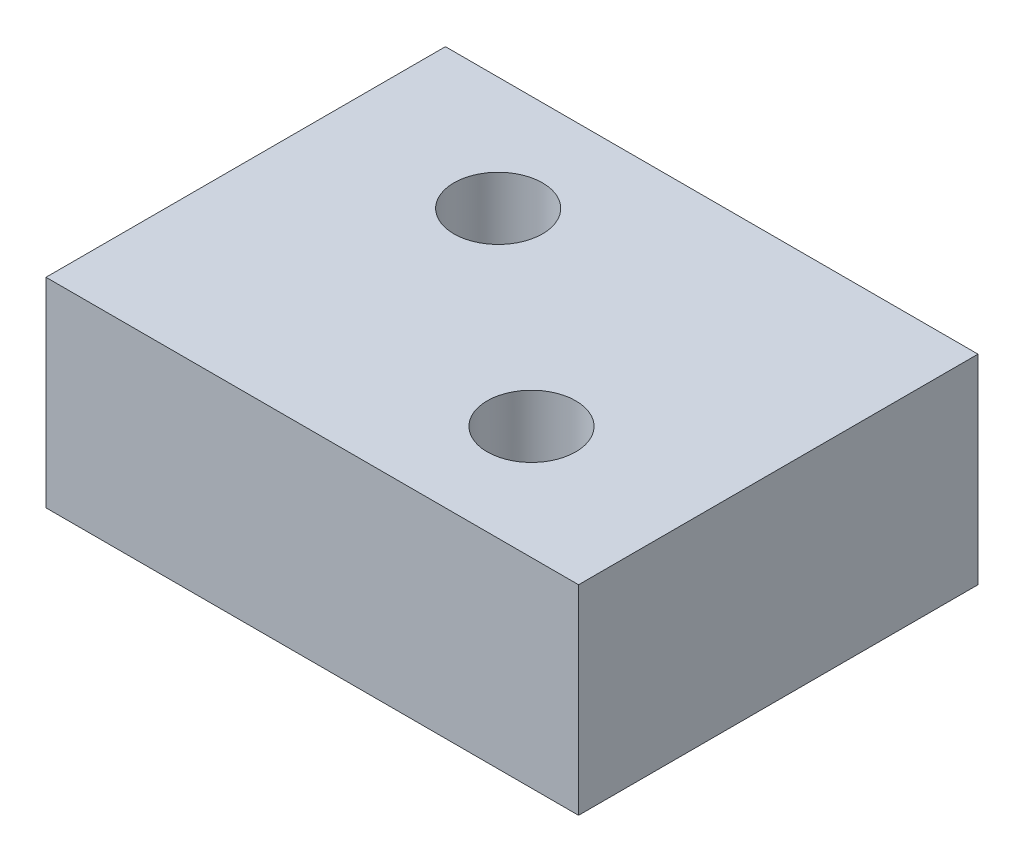
ISO-10303-21;
HEADER;
FILE_DESCRIPTION(('STEP AP214'),'2;1');
FILE_NAME('part.step','',(''),(''),'','','');
FILE_SCHEMA(('AUTOMOTIVE_DESIGN { 1 0 10303 214 1 1 1 1 }'));
ENDSEC;
DATA;
#1=APPLICATION_CONTEXT('core data for automotive mechanical design processes');
#2=APPLICATION_PROTOCOL_DEFINITION('international standard','automotive_design',2000,#1);
#3=PRODUCT_CONTEXT('',#1,'mechanical');
#4=PRODUCT('Part','Part','',(#3));
#5=PRODUCT_RELATED_PRODUCT_CATEGORY('part','',(#4));
#6=PRODUCT_DEFINITION_FORMATION('','',#4);
#7=PRODUCT_DEFINITION_CONTEXT('part definition',#1,'design');
#8=PRODUCT_DEFINITION('design','',#6,#7);
#9=PRODUCT_DEFINITION_SHAPE('','',#8);
#10=(LENGTH_UNIT() NAMED_UNIT(*) SI_UNIT(.MILLI.,.METRE.));
#11=(NAMED_UNIT(*) PLANE_ANGLE_UNIT() SI_UNIT($,.RADIAN.));
#12=(NAMED_UNIT(*) SI_UNIT($,.STERADIAN.) SOLID_ANGLE_UNIT());
#13=UNCERTAINTY_MEASURE_WITH_UNIT(LENGTH_MEASURE(1.E-05),#10,'distance_accuracy_value','');
#14=(GEOMETRIC_REPRESENTATION_CONTEXT(3) GLOBAL_UNCERTAINTY_ASSIGNED_CONTEXT((#13)) GLOBAL_UNIT_ASSIGNED_CONTEXT((#10,
#11,#12)) REPRESENTATION_CONTEXT('',''));
#15=CARTESIAN_POINT('',(0.,0.,0.));
#16=DIRECTION('',(0.,0.,1.));
#17=DIRECTION('',(1.,0.,0.));
#18=AXIS2_PLACEMENT_3D('',#15,#16,#17);
#19=CARTESIAN_POINT('',(20.,10.,15.));
#20=DIRECTION('',(-1.,0.,0.));
#21=DIRECTION('',(0.,0.,1.));
#22=AXIS2_PLACEMENT_3D('',#19,#20,#21);
#23=PLANE('',#22);
#24=DIRECTION('',(0.,0.,-1.));
#25=VECTOR('',#24,1.);
#26=CARTESIAN_POINT('',(20.,0.,15.));
#27=LINE('',#26,#25);
#28=CARTESIAN_POINT('',(20.,0.,15.));
#29=VERTEX_POINT('',#28);
#30=CARTESIAN_POINT('',(20.,0.,-15.));
#31=VERTEX_POINT('',#30);
#32=EDGE_CURVE('E166',#29,#31,#27,.T.);
#33=ORIENTED_EDGE('',*,*,#32,.T.);
#34=DIRECTION('',(0.,-1.,0.));
#35=VECTOR('',#34,1.);
#36=CARTESIAN_POINT('',(20.,10.,-15.));
#37=LINE('',#36,#35);
#38=CARTESIAN_POINT('',(20.,15.,-15.));
#39=VERTEX_POINT('',#38);
#40=EDGE_CURVE('E11',#39,#31,#37,.T.);
#41=ORIENTED_EDGE('',*,*,#40,.F.);
#42=DIRECTION('',(0.,0.,-1.));
#43=VECTOR('',#42,1.);
#44=CARTESIAN_POINT('',(20.,15.,15.));
#45=LINE('',#44,#43);
#46=CARTESIAN_POINT('',(20.,15.,15.));
#47=VERTEX_POINT('',#46);
#48=EDGE_CURVE('E103',#47,#39,#45,.T.);
#49=ORIENTED_EDGE('',*,*,#48,.F.);
#50=DIRECTION('',(0.,-1.,0.));
#51=VECTOR('',#50,1.);
#52=CARTESIAN_POINT('',(20.,10.,15.));
#53=LINE('',#52,#51);
#54=EDGE_CURVE('E94',#47,#29,#53,.T.);
#55=ORIENTED_EDGE('',*,*,#54,.T.);
#56=EDGE_LOOP('',(#33,#41,#49,#55));
#57=FACE_BOUND('',#56,.T.);
#58=ADVANCED_FACE('F46',(#57),#23,.F.);
#59=CARTESIAN_POINT('',(-20.,10.,-15.));
#60=DIRECTION('',(0.,0.,1.));
#61=DIRECTION('',(1.,0.,0.));
#62=AXIS2_PLACEMENT_3D('',#59,#60,#61);
#63=PLANE('',#62);
#64=DIRECTION('',(-1.,0.,0.));
#65=VECTOR('',#64,1.);
#66=CARTESIAN_POINT('',(-20.,0.,-15.));
#67=LINE('',#66,#65);
#68=CARTESIAN_POINT('',(-20.,0.,-15.));
#69=VERTEX_POINT('',#68);
#70=EDGE_CURVE('E173',#31,#69,#67,.T.);
#71=ORIENTED_EDGE('',*,*,#70,.T.);
#72=DIRECTION('',(0.,-1.,0.));
#73=VECTOR('',#72,1.);
#74=CARTESIAN_POINT('',(-20.,10.,-15.));
#75=LINE('',#74,#73);
#76=CARTESIAN_POINT('',(-20.,15.,-15.));
#77=VERTEX_POINT('',#76);
#78=EDGE_CURVE('E55',#77,#69,#75,.T.);
#79=ORIENTED_EDGE('',*,*,#78,.F.);
#80=DIRECTION('',(-1.,0.,0.));
#81=VECTOR('',#80,1.);
#82=CARTESIAN_POINT('',(-20.,15.,-15.));
#83=LINE('',#82,#81);
#84=EDGE_CURVE('E108',#39,#77,#83,.T.);
#85=ORIENTED_EDGE('',*,*,#84,.F.);
#86=ORIENTED_EDGE('',*,*,#40,.T.);
#87=EDGE_LOOP('',(#71,#79,#85,#86));
#88=FACE_BOUND('',#87,.T.);
#89=ADVANCED_FACE('F234',(#88),#63,.F.);
#90=CARTESIAN_POINT('',(-20.,10.,15.));
#91=DIRECTION('',(1.,0.,0.));
#92=DIRECTION('',(0.,0.,-1.));
#93=AXIS2_PLACEMENT_3D('',#90,#91,#92);
#94=PLANE('',#93);
#95=DIRECTION('',(0.,0.,1.));
#96=VECTOR('',#95,1.);
#97=CARTESIAN_POINT('',(-20.,0.,15.));
#98=LINE('',#97,#96);
#99=CARTESIAN_POINT('',(-20.,0.,15.));
#100=VERTEX_POINT('',#99);
#101=EDGE_CURVE('E71',#69,#100,#98,.T.);
#102=ORIENTED_EDGE('',*,*,#101,.T.);
#103=DIRECTION('',(0.,-1.,0.));
#104=VECTOR('',#103,1.);
#105=CARTESIAN_POINT('',(-20.,10.,15.));
#106=LINE('',#105,#104);
#107=CARTESIAN_POINT('',(-20.,15.,15.));
#108=VERTEX_POINT('',#107);
#109=EDGE_CURVE('E88',#108,#100,#106,.T.);
#110=ORIENTED_EDGE('',*,*,#109,.F.);
#111=DIRECTION('',(0.,0.,1.));
#112=VECTOR('',#111,1.);
#113=CARTESIAN_POINT('',(-20.,15.,15.));
#114=LINE('',#113,#112);
#115=EDGE_CURVE('E92',#77,#108,#114,.T.);
#116=ORIENTED_EDGE('',*,*,#115,.F.);
#117=ORIENTED_EDGE('',*,*,#78,.T.);
#118=EDGE_LOOP('',(#102,#110,#116,#117));
#119=FACE_BOUND('',#118,.T.);
#120=ADVANCED_FACE('F90',(#119),#94,.F.);
#121=CARTESIAN_POINT('',(-20.,10.,15.));
#122=DIRECTION('',(0.,0.,-1.));
#123=DIRECTION('',(-1.,0.,0.));
#124=AXIS2_PLACEMENT_3D('',#121,#122,#123);
#125=PLANE('',#124);
#126=DIRECTION('',(1.,0.,0.));
#127=VECTOR('',#126,1.);
#128=CARTESIAN_POINT('',(-20.,0.,15.));
#129=LINE('',#128,#127);
#130=EDGE_CURVE('E63',#100,#29,#129,.T.);
#131=ORIENTED_EDGE('',*,*,#130,.T.);
#132=ORIENTED_EDGE('',*,*,#54,.F.);
#133=DIRECTION('',(1.,0.,0.));
#134=VECTOR('',#133,1.);
#135=CARTESIAN_POINT('',(-20.,15.,15.));
#136=LINE('',#135,#134);
#137=EDGE_CURVE('E97',#108,#47,#136,.T.);
#138=ORIENTED_EDGE('',*,*,#137,.F.);
#139=ORIENTED_EDGE('',*,*,#109,.T.);
#140=EDGE_LOOP('',(#131,#132,#138,#139));
#141=FACE_BOUND('',#140,.T.);
#142=ADVANCED_FACE('F98',(#141),#125,.F.);
#143=CARTESIAN_POINT('',(0.,0.,0.));
#144=DIRECTION('',(0.,-1.,0.));
#145=DIRECTION('',(0.,0.,-1.));
#146=AXIS2_PLACEMENT_3D('',#143,#144,#145);
#147=PLANE('',#146);
#148=CARTESIAN_POINT('',(-13.3333333333333,0.,10.));
#149=DIRECTION('',(0.,-1.,0.));
#150=DIRECTION('',(0.,0.,1.));
#151=AXIS2_PLACEMENT_3D('',#148,#149,#150);
#152=CIRCLE('',#151,2.);
#153=CARTESIAN_POINT('',(-13.3333333333333,0.,12.));
#154=VERTEX_POINT('',#153);
#155=EDGE_CURVE('E146',#154,#154,#152,.T.);
#156=ORIENTED_EDGE('',*,*,#155,.F.);
#157=EDGE_LOOP('',(#156));
#158=FACE_BOUND('',#157,.T.);
#159=CARTESIAN_POINT('',(13.3333333333333,0.,-10.));
#160=DIRECTION('',(0.,-1.,0.));
#161=DIRECTION('',(0.,0.,1.));
#162=AXIS2_PLACEMENT_3D('',#159,#160,#161);
#163=CIRCLE('',#162,2.);
#164=CARTESIAN_POINT('',(13.3333333333333,0.,-8.));
#165=VERTEX_POINT('',#164);
#166=EDGE_CURVE('E155',#165,#165,#163,.T.);
#167=ORIENTED_EDGE('',*,*,#166,.F.);
#168=EDGE_LOOP('',(#167));
#169=FACE_BOUND('',#168,.T.);
#170=CARTESIAN_POINT('',(-13.3333333333333,0.,-9.99999999999999));
#171=DIRECTION('',(0.,-1.,0.));
#172=DIRECTION('',(0.,0.,-1.));
#173=AXIS2_PLACEMENT_3D('',#170,#171,#172);
#174=CIRCLE('',#173,2.);
#175=CARTESIAN_POINT('',(-13.3333333333333,0.,-12.));
#176=VERTEX_POINT('',#175);
#177=EDGE_CURVE('E138',#176,#176,#174,.T.);
#178=ORIENTED_EDGE('',*,*,#177,.F.);
#179=EDGE_LOOP('',(#178));
#180=FACE_BOUND('',#179,.T.);
#181=CARTESIAN_POINT('',(13.3333333333333,0.,10.));
#182=DIRECTION('',(0.,-1.,0.));
#183=DIRECTION('',(0.,0.,-1.));
#184=AXIS2_PLACEMENT_3D('',#181,#182,#183);
#185=CIRCLE('',#184,2.);
#186=CARTESIAN_POINT('',(13.3333333333333,0.,8.));
#187=VERTEX_POINT('',#186);
#188=EDGE_CURVE('E150',#187,#187,#185,.T.);
#189=ORIENTED_EDGE('',*,*,#188,.F.);
#190=EDGE_LOOP('',(#189));
#191=FACE_BOUND('',#190,.T.);
#192=ORIENTED_EDGE('',*,*,#32,.F.);
#193=ORIENTED_EDGE('',*,*,#130,.F.);
#194=ORIENTED_EDGE('',*,*,#101,.F.);
#195=ORIENTED_EDGE('',*,*,#70,.F.);
#196=EDGE_LOOP('',(#192,#193,#194,#195));
#197=FACE_BOUND('',#196,.T.);
#198=ADVANCED_FACE('F243',(#158,#169,#180,#191,#197),#147,.T.);
#199=CARTESIAN_POINT('',(13.3333333333333,5.,10.));
#200=DIRECTION('',(0.,-1.,0.));
#201=DIRECTION('',(0.,0.,-1.));
#202=AXIS2_PLACEMENT_3D('',#199,#200,#201);
#203=CYLINDRICAL_SURFACE('',#202,2.);
#204=CARTESIAN_POINT('',(13.3333333333333,5.,10.));
#205=DIRECTION('',(0.,-1.,0.));
#206=DIRECTION('',(0.,0.,-1.));
#207=AXIS2_PLACEMENT_3D('',#204,#205,#206);
#208=CIRCLE('',#207,2.);
#209=CARTESIAN_POINT('',(13.3333333333333,5.,8.));
#210=VERTEX_POINT('',#209);
#211=EDGE_CURVE('E162',#210,#210,#208,.T.);
#212=ORIENTED_EDGE('',*,*,#211,.F.);
#213=EDGE_LOOP('',(#212));
#214=FACE_BOUND('',#213,.T.);
#215=ORIENTED_EDGE('',*,*,#188,.T.);
#216=EDGE_LOOP('',(#215));
#217=FACE_BOUND('',#216,.T.);
#218=ADVANCED_FACE('F245',(#214,#217),#203,.F.);
#219=CARTESIAN_POINT('',(13.3333333333333,5.,10.));
#220=DIRECTION('',(0.,-1.,0.));
#221=DIRECTION('',(0.,0.,-1.));
#222=AXIS2_PLACEMENT_3D('',#219,#220,#221);
#223=PLANE('',#222);
#224=ORIENTED_EDGE('',*,*,#211,.T.);
#225=EDGE_LOOP('',(#224));
#226=FACE_BOUND('',#225,.T.);
#227=ADVANCED_FACE('F251',(#226),#223,.T.);
#228=CARTESIAN_POINT('',(-13.3333333333333,5.,-9.99999999999999));
#229=DIRECTION('',(0.,-1.,0.));
#230=DIRECTION('',(0.,0.,-1.));
#231=AXIS2_PLACEMENT_3D('',#228,#229,#230);
#232=CYLINDRICAL_SURFACE('',#231,2.);
#233=CARTESIAN_POINT('',(-13.3333333333333,5.,-9.99999999999999));
#234=DIRECTION('',(0.,-1.,0.));
#235=DIRECTION('',(0.,0.,-1.));
#236=AXIS2_PLACEMENT_3D('',#233,#234,#235);
#237=CIRCLE('',#236,2.);
#238=CARTESIAN_POINT('',(-13.3333333333333,5.,-12.));
#239=VERTEX_POINT('',#238);
#240=EDGE_CURVE('E126',#239,#239,#237,.T.);
#241=ORIENTED_EDGE('',*,*,#240,.F.);
#242=EDGE_LOOP('',(#241));
#243=FACE_BOUND('',#242,.T.);
#244=ORIENTED_EDGE('',*,*,#177,.T.);
#245=EDGE_LOOP('',(#244));
#246=FACE_BOUND('',#245,.T.);
#247=ADVANCED_FACE('F371',(#243,#246),#232,.F.);
#248=CARTESIAN_POINT('',(-13.3333333333333,5.,-9.99999999999999));
#249=DIRECTION('',(0.,-1.,0.));
#250=DIRECTION('',(0.,0.,-1.));
#251=AXIS2_PLACEMENT_3D('',#248,#249,#250);
#252=PLANE('',#251);
#253=ORIENTED_EDGE('',*,*,#240,.T.);
#254=EDGE_LOOP('',(#253));
#255=FACE_BOUND('',#254,.T.);
#256=ADVANCED_FACE('F374',(#255),#252,.T.);
#257=CARTESIAN_POINT('',(13.3333333333333,5.,-10.));
#258=DIRECTION('',(0.,-1.,0.));
#259=DIRECTION('',(0.,0.,-1.));
#260=AXIS2_PLACEMENT_3D('',#257,#258,#259);
#261=CYLINDRICAL_SURFACE('',#260,2.);
#262=CARTESIAN_POINT('',(13.3333333333333,5.,-10.));
#263=DIRECTION('',(0.,-1.,0.));
#264=DIRECTION('',(0.,0.,1.));
#265=AXIS2_PLACEMENT_3D('',#262,#263,#264);
#266=CIRCLE('',#265,2.);
#267=CARTESIAN_POINT('',(13.3333333333333,5.,-8.));
#268=VERTEX_POINT('',#267);
#269=EDGE_CURVE('E142',#268,#268,#266,.T.);
#270=ORIENTED_EDGE('',*,*,#269,.F.);
#271=EDGE_LOOP('',(#270));
#272=FACE_BOUND('',#271,.T.);
#273=ORIENTED_EDGE('',*,*,#166,.T.);
#274=EDGE_LOOP('',(#273));
#275=FACE_BOUND('',#274,.T.);
#276=ADVANCED_FACE('F378',(#272,#275),#261,.F.);
#277=CARTESIAN_POINT('',(13.3333333333333,5.,-10.));
#278=DIRECTION('',(0.,1.,0.));
#279=DIRECTION('',(0.,0.,1.));
#280=AXIS2_PLACEMENT_3D('',#277,#278,#279);
#281=PLANE('',#280);
#282=ORIENTED_EDGE('',*,*,#269,.T.);
#283=EDGE_LOOP('',(#282));
#284=FACE_BOUND('',#283,.T.);
#285=ADVANCED_FACE('F383',(#284),#281,.F.);
#286=CARTESIAN_POINT('',(-13.3333333333333,5.,10.));
#287=DIRECTION('',(0.,-1.,0.));
#288=DIRECTION('',(0.,0.,-1.));
#289=AXIS2_PLACEMENT_3D('',#286,#287,#288);
#290=CYLINDRICAL_SURFACE('',#289,2.);
#291=CARTESIAN_POINT('',(-13.3333333333333,5.,10.));
#292=DIRECTION('',(0.,-1.,0.));
#293=DIRECTION('',(0.,0.,1.));
#294=AXIS2_PLACEMENT_3D('',#291,#292,#293);
#295=CIRCLE('',#294,2.);
#296=CARTESIAN_POINT('',(-13.3333333333333,5.,12.));
#297=VERTEX_POINT('',#296);
#298=EDGE_CURVE('E151',#297,#297,#295,.T.);
#299=ORIENTED_EDGE('',*,*,#298,.F.);
#300=EDGE_LOOP('',(#299));
#301=FACE_BOUND('',#300,.T.);
#302=ORIENTED_EDGE('',*,*,#155,.T.);
#303=EDGE_LOOP('',(#302));
#304=FACE_BOUND('',#303,.T.);
#305=ADVANCED_FACE('F380',(#301,#304),#290,.F.);
#306=CARTESIAN_POINT('',(-13.3333333333333,5.,10.));
#307=DIRECTION('',(0.,1.,0.));
#308=DIRECTION('',(0.,0.,1.));
#309=AXIS2_PLACEMENT_3D('',#306,#307,#308);
#310=PLANE('',#309);
#311=ORIENTED_EDGE('',*,*,#298,.T.);
#312=EDGE_LOOP('',(#311));
#313=FACE_BOUND('',#312,.T.);
#314=ADVANCED_FACE('F276',(#313),#310,.F.);
#315=CARTESIAN_POINT('',(0.,15.,0.));
#316=DIRECTION('',(0.,-1.,0.));
#317=DIRECTION('',(0.,0.,-1.));
#318=AXIS2_PLACEMENT_3D('',#315,#316,#317);
#319=PLANE('',#318);
#320=CARTESIAN_POINT('',(7.9286,15.,6.465));
#321=DIRECTION('',(0.,1.,0.));
#322=DIRECTION('',(0.,0.,1.));
#323=AXIS2_PLACEMENT_3D('',#320,#321,#322);
#324=CIRCLE('',#323,3.325);
#325=CARTESIAN_POINT('',(7.9286,15.,9.79));
#326=VERTEX_POINT('',#325);
#327=EDGE_CURVE('E187',#326,#326,#324,.T.);
#328=ORIENTED_EDGE('',*,*,#327,.F.);
#329=EDGE_LOOP('',(#328));
#330=FACE_BOUND('',#329,.T.);
#331=CARTESIAN_POINT('',(-7.5,15.,-6.4636));
#332=DIRECTION('',(0.,1.,0.));
#333=DIRECTION('',(0.,0.,1.));
#334=AXIS2_PLACEMENT_3D('',#331,#332,#333);
#335=CIRCLE('',#334,3.325);
#336=CARTESIAN_POINT('',(-7.5,15.,-3.1386));
#337=VERTEX_POINT('',#336);
#338=EDGE_CURVE('E203',#337,#337,#335,.T.);
#339=ORIENTED_EDGE('',*,*,#338,.F.);
#340=EDGE_LOOP('',(#339));
#341=FACE_BOUND('',#340,.T.);
#342=ORIENTED_EDGE('',*,*,#115,.T.);
#343=ORIENTED_EDGE('',*,*,#137,.T.);
#344=ORIENTED_EDGE('',*,*,#48,.T.);
#345=ORIENTED_EDGE('',*,*,#84,.T.);
#346=EDGE_LOOP('',(#342,#343,#344,#345));
#347=FACE_BOUND('',#346,.T.);
#348=ADVANCED_FACE('F106',(#330,#341,#347),#319,.F.);
#349=CARTESIAN_POINT('',(-7.5,15.,-6.4636));
#350=DIRECTION('',(0.,-1.,0.));
#351=DIRECTION('',(0.,0.,-1.));
#352=AXIS2_PLACEMENT_3D('',#349,#350,#351);
#353=CYLINDRICAL_SURFACE('',#352,3.325);
#354=CARTESIAN_POINT('',(-7.5,10.,-6.4636));
#355=DIRECTION('',(0.,-1.,0.));
#356=DIRECTION('',(0.,0.,-1.));
#357=AXIS2_PLACEMENT_3D('',#354,#355,#356);
#358=CIRCLE('',#357,3.325);
#359=CARTESIAN_POINT('',(-7.5,10.,-9.7886));
#360=VERTEX_POINT('',#359);
#361=EDGE_CURVE('E183',#360,#360,#358,.F.);
#362=ORIENTED_EDGE('',*,*,#361,.F.);
#363=EDGE_LOOP('',(#362));
#364=FACE_BOUND('',#363,.T.);
#365=ORIENTED_EDGE('',*,*,#338,.T.);
#366=EDGE_LOOP('',(#365));
#367=FACE_BOUND('',#366,.T.);
#368=ADVANCED_FACE('F218',(#364,#367),#353,.F.);
#369=CARTESIAN_POINT('',(7.9286,15.,6.465));
#370=DIRECTION('',(0.,-1.,0.));
#371=DIRECTION('',(0.,0.,-1.));
#372=AXIS2_PLACEMENT_3D('',#369,#370,#371);
#373=CYLINDRICAL_SURFACE('',#372,3.325);
#374=CARTESIAN_POINT('',(7.9286,10.,6.465));
#375=DIRECTION('',(0.,-1.,0.));
#376=DIRECTION('',(0.,0.,-1.));
#377=AXIS2_PLACEMENT_3D('',#374,#375,#376);
#378=CIRCLE('',#377,3.325);
#379=CARTESIAN_POINT('',(7.9286,10.,3.14));
#380=VERTEX_POINT('',#379);
#381=EDGE_CURVE('E49',#380,#380,#378,.F.);
#382=ORIENTED_EDGE('',*,*,#381,.F.);
#383=EDGE_LOOP('',(#382));
#384=FACE_BOUND('',#383,.T.);
#385=ORIENTED_EDGE('',*,*,#327,.T.);
#386=EDGE_LOOP('',(#385));
#387=FACE_BOUND('',#386,.T.);
#388=ADVANCED_FACE('F231',(#384,#387),#373,.F.);
#389=CARTESIAN_POINT('',(-7.5,6.,-6.4636));
#390=DIRECTION('',(0.,1.,0.));
#391=DIRECTION('',(0.,0.,1.));
#392=AXIS2_PLACEMENT_3D('',#389,#390,#391);
#393=PLANE('',#392);
#394=CARTESIAN_POINT('',(-7.5,6.,-6.4636));
#395=DIRECTION('',(0.,1.,0.));
#396=DIRECTION('',(0.,0.,1.));
#397=AXIS2_PLACEMENT_3D('',#394,#395,#396);
#398=CIRCLE('',#397,3.325);
#399=CARTESIAN_POINT('',(-7.5,6.,-3.1386));
#400=VERTEX_POINT('',#399);
#401=EDGE_CURVE('E186',#400,#400,#398,.F.);
#402=ORIENTED_EDGE('',*,*,#401,.T.);
#403=EDGE_LOOP('',(#402));
#404=FACE_BOUND('',#403,.T.);
#405=CARTESIAN_POINT('',(-7.5,6.,-6.4636));
#406=DIRECTION('',(0.,1.,0.));
#407=DIRECTION('',(0.,0.,1.));
#408=AXIS2_PLACEMENT_3D('',#405,#406,#407);
#409=CIRCLE('',#408,4.8125);
#410=CARTESIAN_POINT('',(-7.5,6.,-1.6511));
#411=VERTEX_POINT('',#410);
#412=EDGE_CURVE('E127',#411,#411,#409,.T.);
#413=ORIENTED_EDGE('',*,*,#412,.T.);
#414=EDGE_LOOP('',(#413));
#415=FACE_BOUND('',#414,.T.);
#416=ADVANCED_FACE('F293',(#404,#415),#393,.T.);
#417=CARTESIAN_POINT('',(-7.5,6.,-6.4636));
#418=DIRECTION('',(0.,1.,0.));
#419=DIRECTION('',(0.,0.,1.));
#420=AXIS2_PLACEMENT_3D('',#417,#418,#419);
#421=CYLINDRICAL_SURFACE('',#420,4.8125);
#422=ORIENTED_EDGE('',*,*,#412,.F.);
#423=EDGE_LOOP('',(#422));
#424=FACE_BOUND('',#423,.T.);
#425=CARTESIAN_POINT('',(-7.5,10.,-6.4636));
#426=DIRECTION('',(0.,1.,0.));
#427=DIRECTION('',(0.,0.,1.));
#428=AXIS2_PLACEMENT_3D('',#425,#426,#427);
#429=CIRCLE('',#428,4.8125);
#430=CARTESIAN_POINT('',(-7.5,10.,-1.6511));
#431=VERTEX_POINT('',#430);
#432=EDGE_CURVE('E121',#431,#431,#429,.T.);
#433=ORIENTED_EDGE('',*,*,#432,.T.);
#434=EDGE_LOOP('',(#433));
#435=FACE_BOUND('',#434,.T.);
#436=ADVANCED_FACE('F225',(#424,#435),#421,.F.);
#437=CARTESIAN_POINT('',(0.,10.,0.));
#438=DIRECTION('',(0.,-1.,0.));
#439=DIRECTION('',(0.,0.,-1.));
#440=AXIS2_PLACEMENT_3D('',#437,#438,#439);
#441=PLANE('',#440);
#442=ORIENTED_EDGE('',*,*,#361,.T.);
#443=EDGE_LOOP('',(#442));
#444=FACE_BOUND('',#443,.T.);
#445=ORIENTED_EDGE('',*,*,#432,.F.);
#446=EDGE_LOOP('',(#445));
#447=FACE_BOUND('',#446,.T.);
#448=ADVANCED_FACE('F215',(#444,#447),#441,.T.);
#449=ORIENTED_EDGE('',*,*,#401,.F.);
#450=EDGE_LOOP('',(#449));
#451=FACE_BOUND('',#450,.T.);
#452=CARTESIAN_POINT('',(-7.5,5.,-6.4636));
#453=DIRECTION('',(0.,1.,0.));
#454=DIRECTION('',(0.,0.,1.));
#455=AXIS2_PLACEMENT_3D('',#452,#453,#454);
#456=CIRCLE('',#455,3.325);
#457=CARTESIAN_POINT('',(-7.5,5.,-3.1386));
#458=VERTEX_POINT('',#457);
#459=EDGE_CURVE('E200',#458,#458,#456,.T.);
#460=ORIENTED_EDGE('',*,*,#459,.F.);
#461=EDGE_LOOP('',(#460));
#462=FACE_BOUND('',#461,.T.);
#463=ADVANCED_FACE('F213',(#451,#462),#353,.F.);
#464=CARTESIAN_POINT('',(-7.5,5.,-6.4636));
#465=DIRECTION('',(0.,1.,0.));
#466=DIRECTION('',(0.,0.,1.));
#467=AXIS2_PLACEMENT_3D('',#464,#465,#466);
#468=PLANE('',#467);
#469=ORIENTED_EDGE('',*,*,#459,.T.);
#470=EDGE_LOOP('',(#469));
#471=FACE_BOUND('',#470,.T.);
#472=ADVANCED_FACE('F211',(#471),#468,.T.);
#473=CARTESIAN_POINT('',(7.9286,6.,6.465));
#474=DIRECTION('',(0.,1.,0.));
#475=DIRECTION('',(0.,0.,1.));
#476=AXIS2_PLACEMENT_3D('',#473,#474,#475);
#477=PLANE('',#476);
#478=CARTESIAN_POINT('',(7.9286,6.,6.465));
#479=DIRECTION('',(0.,1.,0.));
#480=DIRECTION('',(0.,0.,1.));
#481=AXIS2_PLACEMENT_3D('',#478,#479,#480);
#482=CIRCLE('',#481,3.325);
#483=CARTESIAN_POINT('',(7.9286,6.,9.79));
#484=VERTEX_POINT('',#483);
#485=EDGE_CURVE('E110',#484,#484,#482,.F.);
#486=ORIENTED_EDGE('',*,*,#485,.T.);
#487=EDGE_LOOP('',(#486));
#488=FACE_BOUND('',#487,.T.);
#489=CARTESIAN_POINT('',(7.9286,6.,6.465));
#490=DIRECTION('',(0.,1.,0.));
#491=DIRECTION('',(0.,0.,1.));
#492=AXIS2_PLACEMENT_3D('',#489,#490,#491);
#493=CIRCLE('',#492,4.8125);
#494=CARTESIAN_POINT('',(7.9286,6.,11.2775));
#495=VERTEX_POINT('',#494);
#496=EDGE_CURVE('E122',#495,#495,#493,.T.);
#497=ORIENTED_EDGE('',*,*,#496,.T.);
#498=EDGE_LOOP('',(#497));
#499=FACE_BOUND('',#498,.T.);
#500=ADVANCED_FACE('F223',(#488,#499),#477,.T.);
#501=CARTESIAN_POINT('',(7.9286,6.,6.465));
#502=DIRECTION('',(0.,1.,0.));
#503=DIRECTION('',(0.,0.,1.));
#504=AXIS2_PLACEMENT_3D('',#501,#502,#503);
#505=CYLINDRICAL_SURFACE('',#504,4.8125);
#506=ORIENTED_EDGE('',*,*,#496,.F.);
#507=EDGE_LOOP('',(#506));
#508=FACE_BOUND('',#507,.T.);
#509=CARTESIAN_POINT('',(7.9286,10.,6.465));
#510=DIRECTION('',(0.,1.,0.));
#511=DIRECTION('',(0.,0.,1.));
#512=AXIS2_PLACEMENT_3D('',#509,#510,#511);
#513=CIRCLE('',#512,4.8125);
#514=CARTESIAN_POINT('',(7.9286,10.,11.2775));
#515=VERTEX_POINT('',#514);
#516=EDGE_CURVE('E128',#515,#515,#513,.T.);
#517=ORIENTED_EDGE('',*,*,#516,.T.);
#518=EDGE_LOOP('',(#517));
#519=FACE_BOUND('',#518,.T.);
#520=ADVANCED_FACE('F317',(#508,#519),#505,.F.);
#521=ORIENTED_EDGE('',*,*,#381,.T.);
#522=EDGE_LOOP('',(#521));
#523=FACE_BOUND('',#522,.T.);
#524=ORIENTED_EDGE('',*,*,#516,.F.);
#525=EDGE_LOOP('',(#524));
#526=FACE_BOUND('',#525,.T.);
#527=ADVANCED_FACE('F227',(#523,#526),#441,.T.);
#528=ORIENTED_EDGE('',*,*,#485,.F.);
#529=EDGE_LOOP('',(#528));
#530=FACE_BOUND('',#529,.T.);
#531=CARTESIAN_POINT('',(7.9286,5.,6.465));
#532=DIRECTION('',(0.,1.,0.));
#533=DIRECTION('',(0.,0.,1.));
#534=AXIS2_PLACEMENT_3D('',#531,#532,#533);
#535=CIRCLE('',#534,3.325);
#536=CARTESIAN_POINT('',(7.9286,5.,9.79));
#537=VERTEX_POINT('',#536);
#538=EDGE_CURVE('E194',#537,#537,#535,.T.);
#539=ORIENTED_EDGE('',*,*,#538,.F.);
#540=EDGE_LOOP('',(#539));
#541=FACE_BOUND('',#540,.T.);
#542=ADVANCED_FACE('F295',(#530,#541),#373,.F.);
#543=CARTESIAN_POINT('',(7.9286,5.,6.465));
#544=DIRECTION('',(0.,1.,0.));
#545=DIRECTION('',(0.,0.,1.));
#546=AXIS2_PLACEMENT_3D('',#543,#544,#545);
#547=PLANE('',#546);
#548=ORIENTED_EDGE('',*,*,#538,.T.);
#549=EDGE_LOOP('',(#548));
#550=FACE_BOUND('',#549,.T.);
#551=ADVANCED_FACE('F328',(#550),#547,.T.);
#552=CLOSED_SHELL('',(#58,#89,#120,#142,#198,#218,#227,#247,#256,#276,#285,#305,#314,#348,#368,
#388,#416,#436,#448,#463,#472,#500,#520,#527,#542,#551));
#553=MANIFOLD_SOLID_BREP('B2',#552);
#554=ADVANCED_BREP_SHAPE_REPRESENTATION('',(#18,#553),#14);
#555=SHAPE_DEFINITION_REPRESENTATION(#9,#554);
ENDSEC;
END-ISO-10303-21;
